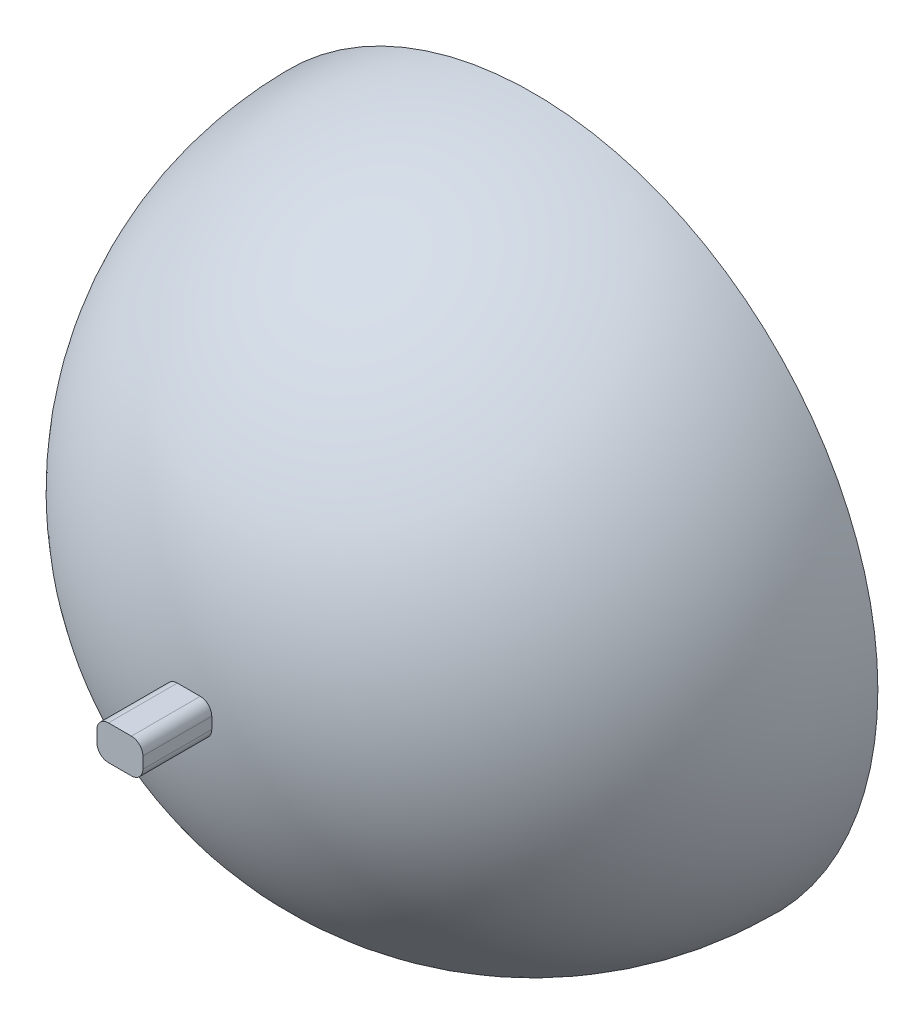
ISO-10303-21;
HEADER;
FILE_DESCRIPTION(('STEP AP214'),'2;1');
FILE_NAME('part.step','',(''),(''),'','','');
FILE_SCHEMA(('AUTOMOTIVE_DESIGN { 1 0 10303 214 1 1 1 1 }'));
ENDSEC;
DATA;
#1=APPLICATION_CONTEXT('core data for automotive mechanical design processes');
#2=APPLICATION_PROTOCOL_DEFINITION('international standard','automotive_design',2000,#1);
#3=PRODUCT_CONTEXT('',#1,'mechanical');
#4=PRODUCT('Part','Part','',(#3));
#5=PRODUCT_RELATED_PRODUCT_CATEGORY('part','',(#4));
#6=PRODUCT_DEFINITION_FORMATION('','',#4);
#7=PRODUCT_DEFINITION_CONTEXT('part definition',#1,'design');
#8=PRODUCT_DEFINITION('design','',#6,#7);
#9=PRODUCT_DEFINITION_SHAPE('','',#8);
#10=(LENGTH_UNIT() NAMED_UNIT(*) SI_UNIT(.MILLI.,.METRE.));
#11=(NAMED_UNIT(*) PLANE_ANGLE_UNIT() SI_UNIT($,.RADIAN.));
#12=(NAMED_UNIT(*) SI_UNIT($,.STERADIAN.) SOLID_ANGLE_UNIT());
#13=UNCERTAINTY_MEASURE_WITH_UNIT(LENGTH_MEASURE(1.E-05),#10,'distance_accuracy_value','');
#14=(GEOMETRIC_REPRESENTATION_CONTEXT(3) GLOBAL_UNCERTAINTY_ASSIGNED_CONTEXT((#13)) GLOBAL_UNIT_ASSIGNED_CONTEXT((#10,
#11,#12)) REPRESENTATION_CONTEXT('',''));
#15=CARTESIAN_POINT('',(0.,0.,0.));
#16=DIRECTION('',(0.,0.,1.));
#17=DIRECTION('',(1.,0.,0.));
#18=AXIS2_PLACEMENT_3D('',#15,#16,#17);
#19=CARTESIAN_POINT('',(1.,15.,15.));
#20=DIRECTION('',(0.,0.,1.));
#21=DIRECTION('',(1.,0.,0.));
#22=AXIS2_PLACEMENT_3D('',#19,#20,#21);
#23=PLANE('',#22);
#24=DIRECTION('',(0.,1.,0.));
#25=VECTOR('',#24,1.);
#26=CARTESIAN_POINT('',(-1.,15.,15.));
#27=LINE('',#26,#25);
#28=CARTESIAN_POINT('',(-1.,14.,15.));
#29=VERTEX_POINT('',#28);
#30=CARTESIAN_POINT('',(-1.,14.5,15.));
#31=VERTEX_POINT('',#30);
#32=EDGE_CURVE('E177',#29,#31,#27,.T.);
#33=ORIENTED_EDGE('',*,*,#32,.T.);
#34=CARTESIAN_POINT('',(-0.5,14.5,15.));
#35=DIRECTION('',(0.,0.,1.));
#36=DIRECTION('',(1.,0.,0.));
#37=AXIS2_PLACEMENT_3D('',#34,#35,#36);
#38=CIRCLE('',#37,0.5);
#39=CARTESIAN_POINT('',(-0.5,15.,15.));
#40=VERTEX_POINT('',#39);
#41=EDGE_CURVE('E158',#31,#40,#38,.F.);
#42=ORIENTED_EDGE('',*,*,#41,.T.);
#43=DIRECTION('',(-1.,0.,0.));
#44=VECTOR('',#43,1.);
#45=CARTESIAN_POINT('',(1.,15.,15.));
#46=LINE('',#45,#44);
#47=CARTESIAN_POINT('',(0.5,15.,15.));
#48=VERTEX_POINT('',#47);
#49=EDGE_CURVE('E137',#48,#40,#46,.T.);
#50=ORIENTED_EDGE('',*,*,#49,.F.);
#51=CARTESIAN_POINT('',(0.5,14.5,15.));
#52=DIRECTION('',(0.,0.,1.));
#53=DIRECTION('',(1.,0.,0.));
#54=AXIS2_PLACEMENT_3D('',#51,#52,#53);
#55=CIRCLE('',#54,0.5);
#56=CARTESIAN_POINT('',(1.,14.5,15.));
#57=VERTEX_POINT('',#56);
#58=EDGE_CURVE('E142',#48,#57,#55,.F.);
#59=ORIENTED_EDGE('',*,*,#58,.T.);
#60=DIRECTION('',(0.,1.,0.));
#61=VECTOR('',#60,1.);
#62=CARTESIAN_POINT('',(1.,15.,15.));
#63=LINE('',#62,#61);
#64=CARTESIAN_POINT('',(1.,14.,15.));
#65=VERTEX_POINT('',#64);
#66=EDGE_CURVE('E168',#65,#57,#63,.T.);
#67=ORIENTED_EDGE('',*,*,#66,.F.);
#68=CARTESIAN_POINT('',(0.5,14.,15.));
#69=DIRECTION('',(0.,0.,1.));
#70=DIRECTION('',(1.,0.,0.));
#71=AXIS2_PLACEMENT_3D('',#68,#69,#70);
#72=CIRCLE('',#71,0.5);
#73=CARTESIAN_POINT('',(0.5,13.5,15.));
#74=VERTEX_POINT('',#73);
#75=EDGE_CURVE('E73',#65,#74,#72,.F.);
#76=ORIENTED_EDGE('',*,*,#75,.T.);
#77=DIRECTION('',(-1.,0.,0.));
#78=VECTOR('',#77,1.);
#79=CARTESIAN_POINT('',(1.,13.5,15.));
#80=LINE('',#79,#78);
#81=CARTESIAN_POINT('',(-0.5,13.5,15.));
#82=VERTEX_POINT('',#81);
#83=EDGE_CURVE('E174',#74,#82,#80,.T.);
#84=ORIENTED_EDGE('',*,*,#83,.T.);
#85=CARTESIAN_POINT('',(-0.5,14.,15.));
#86=DIRECTION('',(0.,0.,1.));
#87=DIRECTION('',(1.,0.,0.));
#88=AXIS2_PLACEMENT_3D('',#85,#86,#87);
#89=CIRCLE('',#88,0.5);
#90=EDGE_CURVE('E65',#82,#29,#89,.F.);
#91=ORIENTED_EDGE('',*,*,#90,.T.);
#92=EDGE_LOOP('',(#33,#42,#50,#59,#67,#76,#84,#91));
#93=FACE_BOUND('',#92,.T.);
#94=ADVANCED_FACE('F50',(#93),#23,.F.);
#95=CARTESIAN_POINT('',(1.,15.,15.));
#96=DIRECTION('',(0.,-1.,0.));
#97=DIRECTION('',(0.,0.,-1.));
#98=AXIS2_PLACEMENT_3D('',#95,#96,#97);
#99=PLANE('',#98);
#100=ORIENTED_EDGE('',*,*,#49,.T.);
#101=DIRECTION('',(0.,0.,1.));
#102=VECTOR('',#101,1.);
#103=CARTESIAN_POINT('',(-0.5,15.,18.));
#104=LINE('',#103,#102);
#105=CARTESIAN_POINT('',(-0.5,15.,18.));
#106=VERTEX_POINT('',#105);
#107=EDGE_CURVE('E136',#40,#106,#104,.T.);
#108=ORIENTED_EDGE('',*,*,#107,.T.);
#109=DIRECTION('',(-1.,0.,0.));
#110=VECTOR('',#109,1.);
#111=CARTESIAN_POINT('',(1.,15.,18.));
#112=LINE('',#111,#110);
#113=CARTESIAN_POINT('',(0.5,15.,18.));
#114=VERTEX_POINT('',#113);
#115=EDGE_CURVE('E120',#114,#106,#112,.T.);
#116=ORIENTED_EDGE('',*,*,#115,.F.);
#117=DIRECTION('',(0.,0.,1.));
#118=VECTOR('',#117,1.);
#119=CARTESIAN_POINT('',(0.5,15.,15.));
#120=LINE('',#119,#118);
#121=EDGE_CURVE('E133',#114,#48,#120,.F.);
#122=ORIENTED_EDGE('',*,*,#121,.T.);
#123=EDGE_LOOP('',(#100,#108,#116,#122));
#124=FACE_BOUND('',#123,.T.);
#125=ADVANCED_FACE('F132',(#124),#99,.F.);
#126=CARTESIAN_POINT('',(1.,15.,18.));
#127=DIRECTION('',(0.,0.,-1.));
#128=DIRECTION('',(-1.,0.,0.));
#129=AXIS2_PLACEMENT_3D('',#126,#127,#128);
#130=PLANE('',#129);
#131=ORIENTED_EDGE('',*,*,#115,.T.);
#132=CARTESIAN_POINT('',(-0.5,14.5,18.));
#133=DIRECTION('',(0.,0.,-1.));
#134=DIRECTION('',(-1.,0.,0.));
#135=AXIS2_PLACEMENT_3D('',#132,#133,#134);
#136=CIRCLE('',#135,0.5);
#137=CARTESIAN_POINT('',(-1.,14.5,18.));
#138=VERTEX_POINT('',#137);
#139=EDGE_CURVE('E149',#106,#138,#136,.F.);
#140=ORIENTED_EDGE('',*,*,#139,.T.);
#141=DIRECTION('',(0.,-1.,0.));
#142=VECTOR('',#141,1.);
#143=CARTESIAN_POINT('',(-1.,15.,18.));
#144=LINE('',#143,#142);
#145=CARTESIAN_POINT('',(-1.,14.,18.));
#146=VERTEX_POINT('',#145);
#147=EDGE_CURVE('E172',#138,#146,#144,.T.);
#148=ORIENTED_EDGE('',*,*,#147,.T.);
#149=CARTESIAN_POINT('',(-0.5,14.,18.));
#150=DIRECTION('',(0.,0.,-1.));
#151=DIRECTION('',(-1.,0.,0.));
#152=AXIS2_PLACEMENT_3D('',#149,#150,#151);
#153=CIRCLE('',#152,0.5);
#154=CARTESIAN_POINT('',(-0.5,13.5,18.));
#155=VERTEX_POINT('',#154);
#156=EDGE_CURVE('E126',#146,#155,#153,.F.);
#157=ORIENTED_EDGE('',*,*,#156,.T.);
#158=DIRECTION('',(-1.,0.,0.));
#159=VECTOR('',#158,1.);
#160=CARTESIAN_POINT('',(1.,13.5,18.));
#161=LINE('',#160,#159);
#162=CARTESIAN_POINT('',(0.5,13.5,18.));
#163=VERTEX_POINT('',#162);
#164=EDGE_CURVE('E138',#163,#155,#161,.T.);
#165=ORIENTED_EDGE('',*,*,#164,.F.);
#166=CARTESIAN_POINT('',(0.5,14.,18.));
#167=DIRECTION('',(0.,0.,-1.));
#168=DIRECTION('',(-1.,0.,0.));
#169=AXIS2_PLACEMENT_3D('',#166,#167,#168);
#170=CIRCLE('',#169,0.5);
#171=CARTESIAN_POINT('',(1.,14.,18.));
#172=VERTEX_POINT('',#171);
#173=EDGE_CURVE('E127',#163,#172,#170,.F.);
#174=ORIENTED_EDGE('',*,*,#173,.T.);
#175=DIRECTION('',(0.,-1.,0.));
#176=VECTOR('',#175,1.);
#177=CARTESIAN_POINT('',(1.,15.,18.));
#178=LINE('',#177,#176);
#179=CARTESIAN_POINT('',(1.,14.5,18.));
#180=VERTEX_POINT('',#179);
#181=EDGE_CURVE('E122',#180,#172,#178,.T.);
#182=ORIENTED_EDGE('',*,*,#181,.F.);
#183=CARTESIAN_POINT('',(0.5,14.5,18.));
#184=DIRECTION('',(0.,0.,-1.));
#185=DIRECTION('',(-1.,0.,0.));
#186=AXIS2_PLACEMENT_3D('',#183,#184,#185);
#187=CIRCLE('',#186,0.5);
#188=EDGE_CURVE('E117',#180,#114,#187,.F.);
#189=ORIENTED_EDGE('',*,*,#188,.T.);
#190=EDGE_LOOP('',(#131,#140,#148,#157,#165,#174,#182,#189));
#191=FACE_BOUND('',#190,.T.);
#192=ADVANCED_FACE('F119',(#191),#130,.F.);
#193=CARTESIAN_POINT('',(1.,13.5,15.));
#194=DIRECTION('',(0.,1.,0.));
#195=DIRECTION('',(0.,0.,1.));
#196=AXIS2_PLACEMENT_3D('',#193,#194,#195);
#197=PLANE('',#196);
#198=ORIENTED_EDGE('',*,*,#164,.T.);
#199=DIRECTION('',(0.,0.,-1.));
#200=VECTOR('',#199,1.);
#201=CARTESIAN_POINT('',(-0.5,13.5,15.));
#202=LINE('',#201,#200);
#203=EDGE_CURVE('E162',#155,#82,#202,.T.);
#204=ORIENTED_EDGE('',*,*,#203,.T.);
#205=ORIENTED_EDGE('',*,*,#83,.F.);
#206=DIRECTION('',(0.,0.,-1.));
#207=VECTOR('',#206,1.);
#208=CARTESIAN_POINT('',(0.5,13.5,15.));
#209=LINE('',#208,#207);
#210=EDGE_CURVE('E160',#74,#163,#209,.F.);
#211=ORIENTED_EDGE('',*,*,#210,.T.);
#212=EDGE_LOOP('',(#198,#204,#205,#211));
#213=FACE_BOUND('',#212,.T.);
#214=ADVANCED_FACE('F185',(#213),#197,.F.);
#215=CARTESIAN_POINT('',(1.,0.,0.));
#216=DIRECTION('',(-1.,0.,0.));
#217=DIRECTION('',(0.,0.,1.));
#218=AXIS2_PLACEMENT_3D('',#215,#216,#217);
#219=PLANE('',#218);
#220=ORIENTED_EDGE('',*,*,#66,.T.);
#221=DIRECTION('',(0.,0.,1.));
#222=VECTOR('',#221,1.);
#223=CARTESIAN_POINT('',(1.,14.5,0.));
#224=LINE('',#223,#222);
#225=EDGE_CURVE('E12',#57,#180,#224,.T.);
#226=ORIENTED_EDGE('',*,*,#225,.T.);
#227=ORIENTED_EDGE('',*,*,#181,.T.);
#228=DIRECTION('',(0.,0.,-1.));
#229=VECTOR('',#228,1.);
#230=CARTESIAN_POINT('',(1.,14.,0.));
#231=LINE('',#230,#229);
#232=EDGE_CURVE('E58',#172,#65,#231,.T.);
#233=ORIENTED_EDGE('',*,*,#232,.T.);
#234=EDGE_LOOP('',(#220,#226,#227,#233));
#235=FACE_BOUND('',#234,.T.);
#236=ADVANCED_FACE('F167',(#235),#219,.F.);
#237=CARTESIAN_POINT('',(-1.,0.,0.));
#238=DIRECTION('',(-1.,0.,0.));
#239=DIRECTION('',(0.,0.,1.));
#240=AXIS2_PLACEMENT_3D('',#237,#238,#239);
#241=PLANE('',#240);
#242=ORIENTED_EDGE('',*,*,#147,.F.);
#243=DIRECTION('',(0.,0.,1.));
#244=VECTOR('',#243,1.);
#245=CARTESIAN_POINT('',(-1.,14.5,15.));
#246=LINE('',#245,#244);
#247=EDGE_CURVE('E153',#138,#31,#246,.F.);
#248=ORIENTED_EDGE('',*,*,#247,.T.);
#249=ORIENTED_EDGE('',*,*,#32,.F.);
#250=DIRECTION('',(0.,0.,-1.));
#251=VECTOR('',#250,1.);
#252=CARTESIAN_POINT('',(-1.,14.,18.));
#253=LINE('',#252,#251);
#254=EDGE_CURVE('E151',#29,#146,#253,.F.);
#255=ORIENTED_EDGE('',*,*,#254,.T.);
#256=EDGE_LOOP('',(#242,#248,#249,#255));
#257=FACE_BOUND('',#256,.T.);
#258=ADVANCED_FACE('F192',(#257),#241,.T.);
#259=CARTESIAN_POINT('',(-0.5,14.5,15.));
#260=DIRECTION('',(0.,0.,-1.));
#261=DIRECTION('',(0.,1.,0.));
#262=AXIS2_PLACEMENT_3D('',#259,#260,#261);
#263=CYLINDRICAL_SURFACE('',#262,0.5);
#264=ORIENTED_EDGE('',*,*,#41,.F.);
#265=ORIENTED_EDGE('',*,*,#247,.F.);
#266=ORIENTED_EDGE('',*,*,#139,.F.);
#267=ORIENTED_EDGE('',*,*,#107,.F.);
#268=EDGE_LOOP('',(#264,#265,#266,#267));
#269=FACE_BOUND('',#268,.T.);
#270=ADVANCED_FACE('F196',(#269),#263,.T.);
#271=CARTESIAN_POINT('',(-0.5,14.,15.));
#272=DIRECTION('',(0.,0.,1.));
#273=DIRECTION('',(1.,0.,0.));
#274=AXIS2_PLACEMENT_3D('',#271,#272,#273);
#275=CYLINDRICAL_SURFACE('',#274,0.5);
#276=ORIENTED_EDGE('',*,*,#156,.F.);
#277=ORIENTED_EDGE('',*,*,#254,.F.);
#278=ORIENTED_EDGE('',*,*,#90,.F.);
#279=ORIENTED_EDGE('',*,*,#203,.F.);
#280=EDGE_LOOP('',(#276,#277,#278,#279));
#281=FACE_BOUND('',#280,.T.);
#282=ADVANCED_FACE('F188',(#281),#275,.T.);
#283=CARTESIAN_POINT('',(0.5,14.5,0.));
#284=DIRECTION('',(0.,0.,1.));
#285=DIRECTION('',(0.,-1.,0.));
#286=AXIS2_PLACEMENT_3D('',#283,#284,#285);
#287=CYLINDRICAL_SURFACE('',#286,0.5);
#288=ORIENTED_EDGE('',*,*,#58,.F.);
#289=ORIENTED_EDGE('',*,*,#121,.F.);
#290=ORIENTED_EDGE('',*,*,#188,.F.);
#291=ORIENTED_EDGE('',*,*,#225,.F.);
#292=EDGE_LOOP('',(#288,#289,#290,#291));
#293=FACE_BOUND('',#292,.T.);
#294=ADVANCED_FACE('F141',(#293),#287,.T.);
#295=CARTESIAN_POINT('',(0.5,14.,0.));
#296=DIRECTION('',(0.,0.,-1.));
#297=DIRECTION('',(-1.,0.,0.));
#298=AXIS2_PLACEMENT_3D('',#295,#296,#297);
#299=CYLINDRICAL_SURFACE('',#298,0.5);
#300=ORIENTED_EDGE('',*,*,#173,.F.);
#301=ORIENTED_EDGE('',*,*,#210,.F.);
#302=ORIENTED_EDGE('',*,*,#75,.F.);
#303=ORIENTED_EDGE('',*,*,#232,.F.);
#304=EDGE_LOOP('',(#300,#301,#302,#303));
#305=FACE_BOUND('',#304,.T.);
#306=ADVANCED_FACE('F52',(#305),#299,.T.);
#307=CLOSED_SHELL('',(#94,#125,#192,#214,#236,#258,#270,#282,#294,#306));
#308=MANIFOLD_SOLID_BREP('B2',#307);
#309=CARTESIAN_POINT('',(0.,15.,0.));
#310=DIRECTION('',(0.,-1.,0.));
#311=DIRECTION('',(1.,0.,0.));
#312=AXIS2_PLACEMENT_3D('',#309,#310,#311);
#313=SPHERICAL_SURFACE('',#312,15.);
#314=CARTESIAN_POINT('',(0.,15.,0.));
#315=DIRECTION('',(0.,0.,-1.));
#316=DIRECTION('',(-1.,0.,0.));
#317=AXIS2_PLACEMENT_3D('',#314,#315,#316);
#318=SPHERICAL_SURFACE('',#317,15.);
#319=CARTESIAN_POINT('',(0.,15.,0.));
#320=DIRECTION('',(0.,0.,-1.));
#321=DIRECTION('',(-1.,0.,0.));
#322=AXIS2_PLACEMENT_3D('',#319,#320,#321);
#323=CIRCLE('',#322,15.);
#324=CARTESIAN_POINT('',(-15.,15.,1.04744440165294E-13));
#325=VERTEX_POINT('',#324);
#326=EDGE_CURVE('E49',#325,#325,#323,.T.);
#327=ORIENTED_EDGE('',*,*,#326,.F.);
#328=EDGE_LOOP('',(#327));
#329=FACE_BOUND('',#328,.T.);
#330=ADVANCED_FACE('F297',(#329),#318,.T.);
#331=CARTESIAN_POINT('',(0.,15.,0.));
#332=DIRECTION('',(0.,0.,-1.));
#333=DIRECTION('',(-1.,0.,0.));
#334=AXIS2_PLACEMENT_3D('',#331,#332,#333);
#335=PLANE('',#334);
#336=ORIENTED_EDGE('',*,*,#326,.T.);
#337=EDGE_LOOP('',(#336));
#338=FACE_BOUND('',#337,.T.);
#339=ADVANCED_FACE('F305',(#338),#335,.T.);
#340=CLOSED_SHELL('',(#330,#339));
#341=MANIFOLD_SOLID_BREP('B6',#340);
#342=ADVANCED_BREP_SHAPE_REPRESENTATION('',(#18,#308,#341),#14);
#343=SHAPE_DEFINITION_REPRESENTATION(#9,#342);
ENDSEC;
END-ISO-10303-21;
